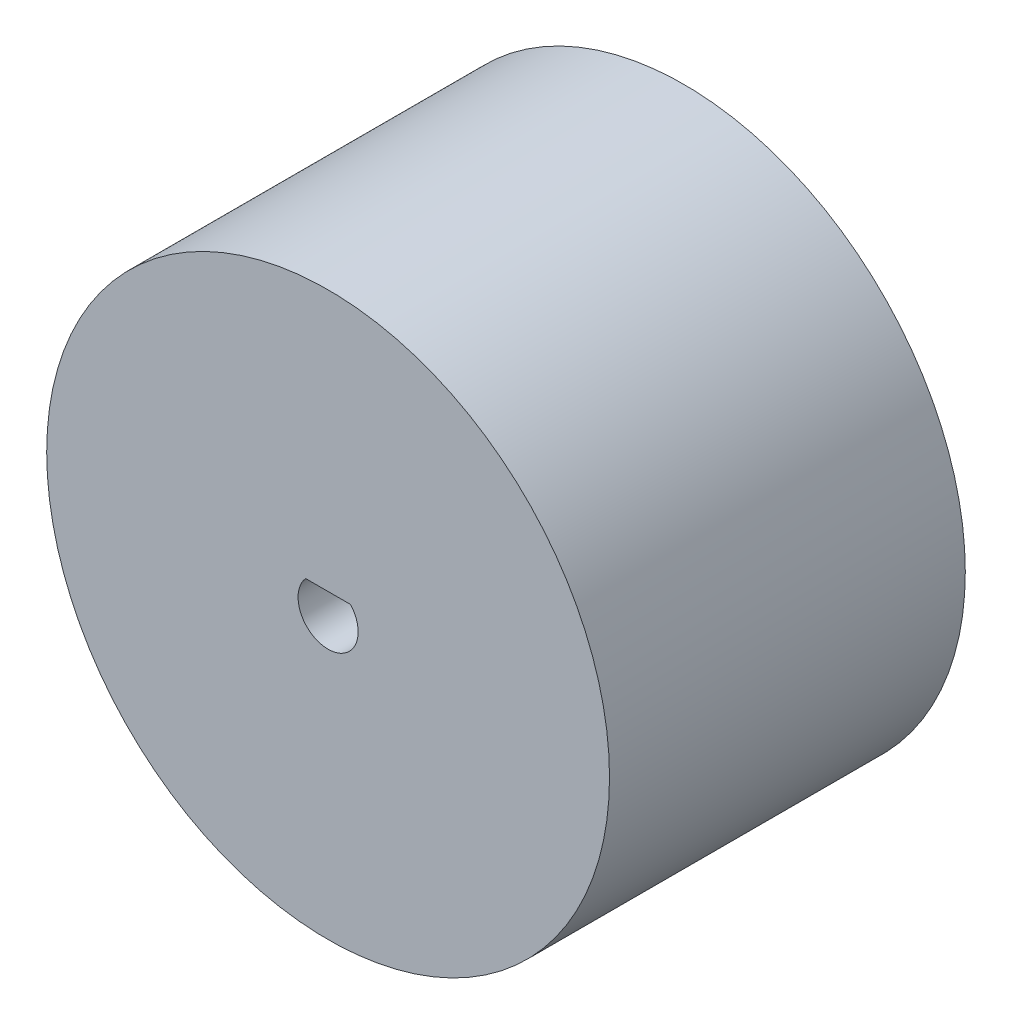
ISO-10303-21;
HEADER;
FILE_DESCRIPTION(('STEP AP214'),'2;1');
FILE_NAME('part.step','',(''),(''),'','','');
FILE_SCHEMA(('AUTOMOTIVE_DESIGN { 1 0 10303 214 1 1 1 1 }'));
ENDSEC;
DATA;
#1=APPLICATION_CONTEXT('core data for automotive mechanical design processes');
#2=APPLICATION_PROTOCOL_DEFINITION('international standard','automotive_design',2000,#1);
#3=PRODUCT_CONTEXT('',#1,'mechanical');
#4=PRODUCT('Part','Part','',(#3));
#5=PRODUCT_RELATED_PRODUCT_CATEGORY('part','',(#4));
#6=PRODUCT_DEFINITION_FORMATION('','',#4);
#7=PRODUCT_DEFINITION_CONTEXT('part definition',#1,'design');
#8=PRODUCT_DEFINITION('design','',#6,#7);
#9=PRODUCT_DEFINITION_SHAPE('','',#8);
#10=(LENGTH_UNIT() NAMED_UNIT(*) SI_UNIT(.MILLI.,.METRE.));
#11=(NAMED_UNIT(*) PLANE_ANGLE_UNIT() SI_UNIT($,.RADIAN.));
#12=(NAMED_UNIT(*) SI_UNIT($,.STERADIAN.) SOLID_ANGLE_UNIT());
#13=UNCERTAINTY_MEASURE_WITH_UNIT(LENGTH_MEASURE(1.E-05),#10,'distance_accuracy_value','');
#14=(GEOMETRIC_REPRESENTATION_CONTEXT(3) GLOBAL_UNCERTAINTY_ASSIGNED_CONTEXT((#13)) GLOBAL_UNIT_ASSIGNED_CONTEXT((#10,
#11,#12)) REPRESENTATION_CONTEXT('',''));
#15=CARTESIAN_POINT('',(0.,0.,0.));
#16=DIRECTION('',(0.,0.,1.));
#17=DIRECTION('',(1.,0.,0.));
#18=AXIS2_PLACEMENT_3D('',#15,#16,#17);
#19=CARTESIAN_POINT('',(0.,0.,17.7));
#20=DIRECTION('',(0.,0.,-1.));
#21=DIRECTION('',(-1.,0.,0.));
#22=AXIS2_PLACEMENT_3D('',#19,#20,#21);
#23=CYLINDRICAL_SURFACE('',#22,14.);
#24=CARTESIAN_POINT('',(0.,0.,17.7));
#25=DIRECTION('',(0.,0.,1.));
#26=DIRECTION('',(1.,0.,0.));
#27=AXIS2_PLACEMENT_3D('',#24,#25,#26);
#28=CIRCLE('',#27,14.);
#29=CARTESIAN_POINT('',(14.,0.,17.7));
#30=VERTEX_POINT('',#29);
#31=EDGE_CURVE('E80',#30,#30,#28,.T.);
#32=ORIENTED_EDGE('',*,*,#31,.F.);
#33=EDGE_LOOP('',(#32));
#34=FACE_BOUND('',#33,.T.);
#35=CARTESIAN_POINT('',(0.,0.,0.));
#36=DIRECTION('',(0.,0.,1.));
#37=DIRECTION('',(1.,0.,0.));
#38=AXIS2_PLACEMENT_3D('',#35,#36,#37);
#39=CIRCLE('',#38,14.);
#40=CARTESIAN_POINT('',(14.,0.,0.));
#41=VERTEX_POINT('',#40);
#42=EDGE_CURVE('E111',#41,#41,#39,.T.);
#43=ORIENTED_EDGE('',*,*,#42,.T.);
#44=EDGE_LOOP('',(#43));
#45=FACE_BOUND('',#44,.T.);
#46=ADVANCED_FACE('F34',(#34,#45),#23,.T.);
#47=CARTESIAN_POINT('',(0.,0.,17.7));
#48=DIRECTION('',(0.,0.,1.));
#49=DIRECTION('',(1.,0.,0.));
#50=AXIS2_PLACEMENT_3D('',#47,#48,#49);
#51=PLANE('',#50);
#52=CARTESIAN_POINT('',(0.,0.00729430503736898,17.7));
#53=DIRECTION('',(0.,0.,1.));
#54=DIRECTION('',(1.,0.,0.));
#55=AXIS2_PLACEMENT_3D('',#52,#53,#54);
#56=CIRCLE('',#55,1.49514701511632);
#57=CARTESIAN_POINT('',(-1.1180339887499,1.,17.7));
#58=VERTEX_POINT('',#57);
#59=CARTESIAN_POINT('',(1.1180339887499,1.,17.7));
#60=VERTEX_POINT('',#59);
#61=EDGE_CURVE('E55',#58,#60,#56,.T.);
#62=ORIENTED_EDGE('',*,*,#61,.F.);
#63=DIRECTION('',(-1.,0.,0.));
#64=VECTOR('',#63,1.);
#65=CARTESIAN_POINT('',(1.1180339887499,1.,17.7));
#66=LINE('',#65,#64);
#67=EDGE_CURVE('E76',#60,#58,#66,.T.);
#68=ORIENTED_EDGE('',*,*,#67,.F.);
#69=EDGE_LOOP('',(#62,#68));
#70=FACE_BOUND('',#69,.T.);
#71=ORIENTED_EDGE('',*,*,#31,.T.);
#72=EDGE_LOOP('',(#71));
#73=FACE_BOUND('',#72,.T.);
#74=ADVANCED_FACE('F121',(#70,#73),#51,.T.);
#75=CARTESIAN_POINT('',(0.,0.,0.));
#76=DIRECTION('',(0.,0.,1.));
#77=DIRECTION('',(1.,0.,0.));
#78=AXIS2_PLACEMENT_3D('',#75,#76,#77);
#79=PLANE('',#78);
#80=CARTESIAN_POINT('',(0.,0.,0.));
#81=DIRECTION('',(0.,0.,1.));
#82=DIRECTION('',(1.,0.,0.));
#83=AXIS2_PLACEMENT_3D('',#80,#81,#82);
#84=CIRCLE('',#83,13.);
#85=CARTESIAN_POINT('',(13.,0.,0.));
#86=VERTEX_POINT('',#85);
#87=EDGE_CURVE('E105',#86,#86,#84,.T.);
#88=ORIENTED_EDGE('',*,*,#87,.T.);
#89=EDGE_LOOP('',(#88));
#90=FACE_BOUND('',#89,.T.);
#91=ORIENTED_EDGE('',*,*,#42,.F.);
#92=EDGE_LOOP('',(#91));
#93=FACE_BOUND('',#92,.T.);
#94=ADVANCED_FACE('F119',(#90,#93),#79,.F.);
#95=CARTESIAN_POINT('',(0.,0.00729430503736898,7.7));
#96=DIRECTION('',(0.,0.,1.));
#97=DIRECTION('',(1.,0.,0.));
#98=AXIS2_PLACEMENT_3D('',#95,#96,#97);
#99=CYLINDRICAL_SURFACE('',#98,1.49514701511632);
#100=ORIENTED_EDGE('',*,*,#61,.T.);
#101=DIRECTION('',(0.,0.,1.));
#102=VECTOR('',#101,1.);
#103=CARTESIAN_POINT('',(1.1180339887499,1.,7.7));
#104=LINE('',#103,#102);
#105=CARTESIAN_POINT('',(1.1180339887499,1.,6.7));
#106=VERTEX_POINT('',#105);
#107=EDGE_CURVE('E72',#106,#60,#104,.T.);
#108=ORIENTED_EDGE('',*,*,#107,.F.);
#109=CARTESIAN_POINT('',(0.,0.00729430503736898,6.7));
#110=DIRECTION('',(0.,0.,1.));
#111=DIRECTION('',(1.,0.,0.));
#112=AXIS2_PLACEMENT_3D('',#109,#110,#111);
#113=CIRCLE('',#112,1.49514701511632);
#114=CARTESIAN_POINT('',(-1.1180339887499,1.,6.7));
#115=VERTEX_POINT('',#114);
#116=EDGE_CURVE('E11',#115,#106,#113,.T.);
#117=ORIENTED_EDGE('',*,*,#116,.F.);
#118=DIRECTION('',(0.,0.,1.));
#119=VECTOR('',#118,1.);
#120=CARTESIAN_POINT('',(-1.1180339887499,1.,7.7));
#121=LINE('',#120,#119);
#122=EDGE_CURVE('E48',#115,#58,#121,.T.);
#123=ORIENTED_EDGE('',*,*,#122,.T.);
#124=EDGE_LOOP('',(#100,#108,#117,#123));
#125=FACE_BOUND('',#124,.T.);
#126=ADVANCED_FACE('F73',(#125),#99,.F.);
#127=CARTESIAN_POINT('',(1.1180339887499,1.,7.7));
#128=DIRECTION('',(0.,1.,0.));
#129=DIRECTION('',(0.,0.,1.));
#130=AXIS2_PLACEMENT_3D('',#127,#128,#129);
#131=PLANE('',#130);
#132=ORIENTED_EDGE('',*,*,#67,.T.);
#133=ORIENTED_EDGE('',*,*,#122,.F.);
#134=DIRECTION('',(-1.,0.,0.));
#135=VECTOR('',#134,1.);
#136=CARTESIAN_POINT('',(0.,1.,6.7));
#137=LINE('',#136,#135);
#138=EDGE_CURVE('E41',#106,#115,#137,.T.);
#139=ORIENTED_EDGE('',*,*,#138,.F.);
#140=ORIENTED_EDGE('',*,*,#107,.T.);
#141=EDGE_LOOP('',(#132,#133,#139,#140));
#142=FACE_BOUND('',#141,.T.);
#143=ADVANCED_FACE('F78',(#142),#131,.F.);
#144=CARTESIAN_POINT('',(0.,0.,17.7));
#145=DIRECTION('',(0.,0.,-1.));
#146=DIRECTION('',(-1.,0.,0.));
#147=AXIS2_PLACEMENT_3D('',#144,#145,#146);
#148=CYLINDRICAL_SURFACE('',#147,13.);
#149=CARTESIAN_POINT('',(0.,0.,16.7));
#150=DIRECTION('',(0.,0.,1.));
#151=DIRECTION('',(1.,0.,0.));
#152=AXIS2_PLACEMENT_3D('',#149,#150,#151);
#153=CIRCLE('',#152,13.);
#154=CARTESIAN_POINT('',(13.,0.,16.7));
#155=VERTEX_POINT('',#154);
#156=EDGE_CURVE('E108',#155,#155,#153,.T.);
#157=ORIENTED_EDGE('',*,*,#156,.T.);
#158=EDGE_LOOP('',(#157));
#159=FACE_BOUND('',#158,.T.);
#160=ORIENTED_EDGE('',*,*,#87,.F.);
#161=EDGE_LOOP('',(#160));
#162=FACE_BOUND('',#161,.T.);
#163=ADVANCED_FACE('F153',(#159,#162),#148,.F.);
#164=CARTESIAN_POINT('',(0.,0.,16.7));
#165=DIRECTION('',(0.,0.,1.));
#166=DIRECTION('',(1.,0.,0.));
#167=AXIS2_PLACEMENT_3D('',#164,#165,#166);
#168=PLANE('',#167);
#169=CARTESIAN_POINT('',(0.,0.00729430503736898,16.7));
#170=DIRECTION('',(0.,0.,1.));
#171=DIRECTION('',(1.,0.,0.));
#172=AXIS2_PLACEMENT_3D('',#169,#170,#171);
#173=CIRCLE('',#172,2.49514701511632);
#174=CARTESIAN_POINT('',(-1.50162666475639,2.,16.7));
#175=VERTEX_POINT('',#174);
#176=CARTESIAN_POINT('',(1.50162666475639,2.,16.7));
#177=VERTEX_POINT('',#176);
#178=EDGE_CURVE('E215',#175,#177,#173,.T.);
#179=ORIENTED_EDGE('',*,*,#178,.T.);
#180=DIRECTION('',(-1.,0.,0.));
#181=VECTOR('',#180,1.);
#182=CARTESIAN_POINT('',(0.,2.,16.7));
#183=LINE('',#182,#181);
#184=EDGE_CURVE('E94',#177,#175,#183,.T.);
#185=ORIENTED_EDGE('',*,*,#184,.T.);
#186=EDGE_LOOP('',(#179,#185));
#187=FACE_BOUND('',#186,.T.);
#188=ORIENTED_EDGE('',*,*,#156,.F.);
#189=EDGE_LOOP('',(#188));
#190=FACE_BOUND('',#189,.T.);
#191=ADVANCED_FACE('F158',(#187,#190),#168,.F.);
#192=CARTESIAN_POINT('',(0.,0.00729430503736898,7.7));
#193=DIRECTION('',(0.,0.,1.));
#194=DIRECTION('',(1.,0.,0.));
#195=AXIS2_PLACEMENT_3D('',#192,#193,#194);
#196=CYLINDRICAL_SURFACE('',#195,2.49514701511632);
#197=ORIENTED_EDGE('',*,*,#178,.F.);
#198=DIRECTION('',(0.,0.,1.));
#199=VECTOR('',#198,1.);
#200=CARTESIAN_POINT('',(-1.50162666475639,2.,6.7));
#201=LINE('',#200,#199);
#202=CARTESIAN_POINT('',(-1.50162666475639,2.,6.7));
#203=VERTEX_POINT('',#202);
#204=EDGE_CURVE('E98',#203,#175,#201,.T.);
#205=ORIENTED_EDGE('',*,*,#204,.F.);
#206=CARTESIAN_POINT('',(0.,0.00729430503736898,6.7));
#207=DIRECTION('',(0.,0.,1.));
#208=DIRECTION('',(1.,0.,0.));
#209=AXIS2_PLACEMENT_3D('',#206,#207,#208);
#210=CIRCLE('',#209,2.49514701511632);
#211=CARTESIAN_POINT('',(1.50162666475639,2.,6.7));
#212=VERTEX_POINT('',#211);
#213=EDGE_CURVE('E89',#203,#212,#210,.T.);
#214=ORIENTED_EDGE('',*,*,#213,.T.);
#215=DIRECTION('',(0.,0.,1.));
#216=VECTOR('',#215,1.);
#217=CARTESIAN_POINT('',(1.50162666475639,2.,6.7));
#218=LINE('',#217,#216);
#219=EDGE_CURVE('E100',#212,#177,#218,.T.);
#220=ORIENTED_EDGE('',*,*,#219,.T.);
#221=EDGE_LOOP('',(#197,#205,#214,#220));
#222=FACE_BOUND('',#221,.T.);
#223=ADVANCED_FACE('F170',(#222),#196,.T.);
#224=CARTESIAN_POINT('',(1.1180339887499,2.,7.7));
#225=DIRECTION('',(0.,1.,0.));
#226=DIRECTION('',(0.,0.,1.));
#227=AXIS2_PLACEMENT_3D('',#224,#225,#226);
#228=PLANE('',#227);
#229=ORIENTED_EDGE('',*,*,#184,.F.);
#230=ORIENTED_EDGE('',*,*,#219,.F.);
#231=DIRECTION('',(-1.,0.,0.));
#232=VECTOR('',#231,1.);
#233=CARTESIAN_POINT('',(0.,2.,6.7));
#234=LINE('',#233,#232);
#235=EDGE_CURVE('E91',#212,#203,#234,.T.);
#236=ORIENTED_EDGE('',*,*,#235,.T.);
#237=ORIENTED_EDGE('',*,*,#204,.T.);
#238=EDGE_LOOP('',(#229,#230,#236,#237));
#239=FACE_BOUND('',#238,.T.);
#240=ADVANCED_FACE('F84',(#239),#228,.T.);
#241=CARTESIAN_POINT('',(0.,0.00729430503736898,6.7));
#242=DIRECTION('',(0.,0.,1.));
#243=DIRECTION('',(1.,0.,0.));
#244=AXIS2_PLACEMENT_3D('',#241,#242,#243);
#245=PLANE('',#244);
#246=ORIENTED_EDGE('',*,*,#138,.T.);
#247=ORIENTED_EDGE('',*,*,#116,.T.);
#248=EDGE_LOOP('',(#246,#247));
#249=FACE_BOUND('',#248,.T.);
#250=ORIENTED_EDGE('',*,*,#213,.F.);
#251=ORIENTED_EDGE('',*,*,#235,.F.);
#252=EDGE_LOOP('',(#250,#251));
#253=FACE_BOUND('',#252,.T.);
#254=ADVANCED_FACE('F81',(#249,#253),#245,.F.);
#255=CLOSED_SHELL('',(#46,#74,#94,#126,#143,#163,#191,#223,#240,#254));
#256=MANIFOLD_SOLID_BREP('B2',#255);
#257=ADVANCED_BREP_SHAPE_REPRESENTATION('',(#18,#256),#14);
#258=SHAPE_DEFINITION_REPRESENTATION(#9,#257);
ENDSEC;
END-ISO-10303-21;
